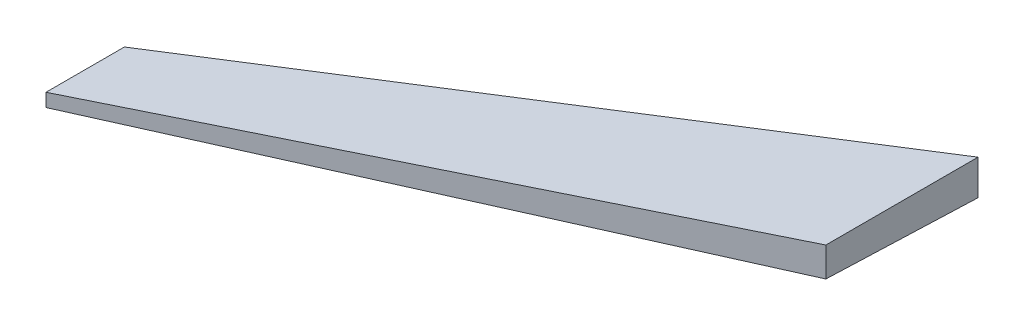
ISO-10303-21;
HEADER;
FILE_DESCRIPTION(('STEP AP214'),'2;1');
FILE_NAME('part.step','',(''),(''),'','','');
FILE_SCHEMA(('AUTOMOTIVE_DESIGN { 1 0 10303 214 1 1 1 1 }'));
ENDSEC;
DATA;
#1=APPLICATION_CONTEXT('core data for automotive mechanical design processes');
#2=APPLICATION_PROTOCOL_DEFINITION('international standard','automotive_design',2000,#1);
#3=PRODUCT_CONTEXT('',#1,'mechanical');
#4=PRODUCT('Part','Part','',(#3));
#5=PRODUCT_RELATED_PRODUCT_CATEGORY('part','',(#4));
#6=PRODUCT_DEFINITION_FORMATION('','',#4);
#7=PRODUCT_DEFINITION_CONTEXT('part definition',#1,'design');
#8=PRODUCT_DEFINITION('design','',#6,#7);
#9=PRODUCT_DEFINITION_SHAPE('','',#8);
#10=(LENGTH_UNIT() NAMED_UNIT(*) SI_UNIT(.MILLI.,.METRE.));
#11=(NAMED_UNIT(*) PLANE_ANGLE_UNIT() SI_UNIT($,.RADIAN.));
#12=(NAMED_UNIT(*) SI_UNIT($,.STERADIAN.) SOLID_ANGLE_UNIT());
#13=UNCERTAINTY_MEASURE_WITH_UNIT(LENGTH_MEASURE(1.E-05),#10,'distance_accuracy_value','');
#14=(GEOMETRIC_REPRESENTATION_CONTEXT(3) GLOBAL_UNCERTAINTY_ASSIGNED_CONTEXT((#13)) GLOBAL_UNIT_ASSIGNED_CONTEXT((#10,
#11,#12)) REPRESENTATION_CONTEXT('',''));
#15=CARTESIAN_POINT('',(0.,0.,0.));
#16=DIRECTION('',(0.,0.,1.));
#17=DIRECTION('',(1.,0.,0.));
#18=AXIS2_PLACEMENT_3D('',#15,#16,#17);
#19=CARTESIAN_POINT('',(-17711.940475464,-80.385008705711,13165.1515428862));
#20=CARTESIAN_POINT('',(0.,-298.277774528723,4907.09615841033));
#21=CARTESIAN_POINT('',(-17711.940475464,-85.1826870549582,12943.9386021868));
#22=CARTESIAN_POINT('',(0.,-321.894328297356,4276.67474022297));
#23=CARTESIAN_POINT('',(-17711.940475464,-89.9803654042046,12722.7256614874));
#24=CARTESIAN_POINT('',(0.,-345.510882065988,3646.25332203561));
#25=CARTESIAN_POINT('',(-17711.940475464,-99.5757221026959,12280.2997800886));
#26=CARTESIAN_POINT('',(0.,-392.743989603252,2385.41048566089));
#27=CARTESIAN_POINT('',(-17711.940475464,-104.373400451941,12059.0868393893));
#28=CARTESIAN_POINT('',(0.,-416.360543371884,1754.98906747353));
#29=CARTESIAN_POINT('',(-17711.940475464,-109.171078801185,11837.87389869));
#30=CARTESIAN_POINT('',(0.,-439.977097140517,1124.56764928617));
#31=B_SPLINE_SURFACE_WITH_KNOTS('',3,1,((#19,#20),(#21,#22),(#23,#24),(#25,#26),(#27,#28),(#29,
#30)),.UNSPECIFIED.,.F.,.F.,.F.,(4,2,4),(2,2),(0.,0.5,1.),(0.,1.),.UNSPECIFIED.);
#32=DIRECTION('',(0.906274153509529,-0.0111490088946297,-0.422543321188791));
#33=VECTOR('',#32,1.);
#34=CARTESIAN_POINT('',(-17711.940475464,-80.385008705711,13165.1515428862));
#35=LINE('',#34,#33);
#36=CARTESIAN_POINT('',(-13224.5432432146,-135.589089570586,11072.9372579865));
#37=VERTEX_POINT('',#36);
#38=CARTESIAN_POINT('',(0.,-298.277774528723,4907.09615841033));
#39=VERTEX_POINT('',#38);
#40=EDGE_CURVE('E161',#37,#39,#35,.T.);
#41=CARTESIAN_POINT('',(-13224.5432432146,-135.589089570586,11072.9372579865));
#42=CARTESIAN_POINT('',(-13224.5432432146,-145.154611939406,10748.0495679373));
#43=CARTESIAN_POINT('',(-13224.5432432146,-154.720134308226,10423.1618778881));
#44=CARTESIAN_POINT('',(-13224.5432432146,-169.068417861456,9935.83034281433));
#45=CARTESIAN_POINT('',(-13224.5432432146,-173.851179045866,9773.38649778973));
#46=CARTESIAN_POINT('',(-13224.5432432146,-183.416701414686,9448.49880774054));
#47=CARTESIAN_POINT('',(-13224.5432432146,-188.199462599097,9286.05496271594));
#48=CARTESIAN_POINT('',(-13224.5432432146,-192.982223783507,9123.61111769134));
#49=B_SPLINE_CURVE_WITH_KNOTS('',3,(#41,#42,#43,#44,#45,#46,#47,#48),.UNSPECIFIED.,.F.,.F.,(4,2,
2,4),(0.,975.085428705194,1462.6281430578,1950.17085741039),.UNSPECIFIED.);
#50=CARTESIAN_POINT('',(-13224.5432432146,-192.982223783507,9123.61111769134));
#51=VERTEX_POINT('',#50);
#52=EDGE_CURVE('E167',#37,#51,#49,.T.);
#53=DIRECTION('',(0.85554228604483,-0.0159789684004121,-0.517486298715285));
#54=VECTOR('',#53,1.);
#55=CARTESIAN_POINT('',(-8855.970237732,-274.574087970851,6481.22077398808));
#56=LINE('',#55,#54);
#57=CARTESIAN_POINT('',(0.,-439.977097140517,1124.56764928617));
#58=VERTEX_POINT('',#57);
#59=EDGE_CURVE('E112',#51,#58,#56,.T.);
#60=DIRECTION('',(0.,0.037435276099573,0.9992990543893));
#61=VECTOR('',#60,1.);
#62=CARTESIAN_POINT('',(0.,-369.12743583462,3015.83190384825));
#63=LINE('',#62,#61);
#64=EDGE_CURVE('E180',#58,#39,#63,.T.);
#65=ORIENTED_EDGE('',*,*,#40,.F.);
#66=ORIENTED_EDGE('',*,*,#52,.T.);
#67=ORIENTED_EDGE('',*,*,#59,.T.);
#68=ORIENTED_EDGE('',*,*,#64,.T.);
#69=EDGE_LOOP('',(#65,#66,#67,#68));
#70=FACE_BOUND('',#69,.T.);
#71=ADVANCED_FACE('F104',(#70),#31,.T.);
#72=CARTESIAN_POINT('',(1879.35745301163,-4.88727022556857E-12,4030.8602679557));
#73=DIRECTION('',(-0.422569584789028,0.,-0.906330483880592));
#74=DIRECTION('',(-0.906330483880592,0.,0.422569584789028));
#75=AXIS2_PLACEMENT_3D('',#72,#73,#74);
#76=PLANE('',#75);
#77=DIRECTION('',(0.,1.,0.));
#78=VECTOR('',#77,1.);
#79=CARTESIAN_POINT('',(-13224.5432432146,-1.34255302771863E-11,11072.9372579865));
#80=LINE('',#79,#78);
#81=CARTESIAN_POINT('',(-13224.5432432146,193.981843528122,11072.9372579865));
#82=VERTEX_POINT('',#81);
#83=EDGE_CURVE('E118',#37,#82,#80,.T.);
#84=ORIENTED_EDGE('',*,*,#83,.F.);
#85=ORIENTED_EDGE('',*,*,#40,.T.);
#86=DIRECTION('',(0.,-1.,0.));
#87=VECTOR('',#86,1.);
#88=CARTESIAN_POINT('',(0.,434.262669847546,4907.09615841033));
#89=LINE('',#88,#87);
#90=CARTESIAN_POINT('',(0.,434.262669847546,4907.09615841033));
#91=VERTEX_POINT('',#90);
#92=EDGE_CURVE('E176',#91,#39,#89,.T.);
#93=ORIENTED_EDGE('',*,*,#92,.F.);
#94=DIRECTION('',(0.90620762167093,0.016465167238481,-0.422512301233143));
#95=VECTOR('',#94,1.);
#96=CARTESIAN_POINT('',(-17711.940475464,112.448931944077,13165.1515428862));
#97=LINE('',#96,#95);
#98=EDGE_CURVE('E164',#82,#91,#97,.T.);
#99=ORIENTED_EDGE('',*,*,#98,.F.);
#100=EDGE_LOOP('',(#84,#85,#93,#99));
#101=FACE_BOUND('',#100,.T.);
#102=ADVANCED_FACE('F191',(#101),#76,.F.);
#103=CARTESIAN_POINT('',(498.008577383891,2.09116891696483E-13,823.340439781124));
#104=DIRECTION('',(0.517552375592634,0.,0.855651528671819));
#105=DIRECTION('',(0.855651528671819,0.,-0.517552375592634));
#106=AXIS2_PLACEMENT_3D('',#103,#104,#105);
#107=PLANE('',#106);
#108=DIRECTION('',(0.,-1.,0.));
#109=VECTOR('',#108,1.);
#110=CARTESIAN_POINT('',(-13224.5432432146,2.31726890335459E-12,9123.61111769134));
#111=LINE('',#110,#109);
#112=CARTESIAN_POINT('',(-13224.5432432146,193.981843528122,9123.61111769134));
#113=VERTEX_POINT('',#112);
#114=EDGE_CURVE('E144',#113,#51,#111,.T.);
#115=ORIENTED_EDGE('',*,*,#114,.F.);
#116=DIRECTION('',(0.85554814333413,0.01554471947013,-0.517489841575772));
#117=VECTOR('',#116,1.);
#118=CARTESIAN_POINT('',(-17711.940475464,112.448931944077,11837.87389869));
#119=LINE('',#118,#117);
#120=CARTESIAN_POINT('',(-1.77635683940025E-12,434.262669847546,1124.56764928618));
#121=VERTEX_POINT('',#120);
#122=EDGE_CURVE('E151',#113,#121,#119,.T.);
#123=ORIENTED_EDGE('',*,*,#122,.T.);
#124=DIRECTION('',(0.,1.,0.));
#125=VECTOR('',#124,1.);
#126=CARTESIAN_POINT('',(0.,434.262669847546,1124.56764928617));
#127=LINE('',#126,#125);
#128=EDGE_CURVE('E158',#58,#121,#127,.T.);
#129=ORIENTED_EDGE('',*,*,#128,.F.);
#130=ORIENTED_EDGE('',*,*,#59,.F.);
#131=EDGE_LOOP('',(#115,#123,#129,#130));
#132=FACE_BOUND('',#131,.T.);
#133=ADVANCED_FACE('F149',(#132),#107,.F.);
#134=CARTESIAN_POINT('',(-7.88764918619134,434.119356703998,0.));
#135=DIRECTION('',(0.0181663117209599,-0.999834978943254,0.));
#136=DIRECTION('',(0.999834978943254,0.0181663117209599,0.));
#137=AXIS2_PLACEMENT_3D('',#134,#135,#136);
#138=PLANE('',#137);
#139=DIRECTION('',(0.,0.,-1.));
#140=VECTOR('',#139,1.);
#141=CARTESIAN_POINT('',(-13224.5432432146,193.981843528122,0.));
#142=LINE('',#141,#140);
#143=EDGE_CURVE('E13',#82,#113,#142,.T.);
#144=ORIENTED_EDGE('',*,*,#143,.F.);
#145=ORIENTED_EDGE('',*,*,#98,.T.);
#146=DIRECTION('',(0.,0.,1.));
#147=VECTOR('',#146,1.);
#148=CARTESIAN_POINT('',(0.,434.262669847546,4907.09615841033));
#149=LINE('',#148,#147);
#150=EDGE_CURVE('E157',#121,#91,#149,.T.);
#151=ORIENTED_EDGE('',*,*,#150,.F.);
#152=ORIENTED_EDGE('',*,*,#122,.F.);
#153=EDGE_LOOP('',(#144,#145,#151,#152));
#154=FACE_BOUND('',#153,.T.);
#155=ADVANCED_FACE('F155',(#154),#138,.F.);
#156=CARTESIAN_POINT('',(0.,434.262669847546,1124.56764928618));
#157=DIRECTION('',(1.,0.,0.));
#158=DIRECTION('',(0.,0.,1.));
#159=AXIS2_PLACEMENT_3D('',#156,#157,#158);
#160=PLANE('',#159);
#161=ORIENTED_EDGE('',*,*,#150,.T.);
#162=ORIENTED_EDGE('',*,*,#92,.T.);
#163=ORIENTED_EDGE('',*,*,#64,.F.);
#164=ORIENTED_EDGE('',*,*,#128,.T.);
#165=EDGE_LOOP('',(#161,#162,#163,#164));
#166=FACE_BOUND('',#165,.T.);
#167=ADVANCED_FACE('F106',(#166),#160,.T.);
#168=CARTESIAN_POINT('',(-13224.5432432146,0.,-2590.80000000001));
#169=DIRECTION('',(-1.,0.,0.));
#170=DIRECTION('',(0.,0.,1.));
#171=AXIS2_PLACEMENT_3D('',#168,#169,#170);
#172=PLANE('',#171);
#173=ORIENTED_EDGE('',*,*,#83,.T.);
#174=ORIENTED_EDGE('',*,*,#143,.T.);
#175=ORIENTED_EDGE('',*,*,#114,.T.);
#176=ORIENTED_EDGE('',*,*,#52,.F.);
#177=EDGE_LOOP('',(#173,#174,#175,#176));
#178=FACE_BOUND('',#177,.T.);
#179=ADVANCED_FACE('F143',(#178),#172,.T.);
#180=CLOSED_SHELL('',(#71,#102,#133,#155,#167,#179));
#181=MANIFOLD_SOLID_BREP('B2',#180);
#182=ADVANCED_BREP_SHAPE_REPRESENTATION('',(#18,#181),#14);
#183=SHAPE_DEFINITION_REPRESENTATION(#9,#182);
ENDSEC;
END-ISO-10303-21;
